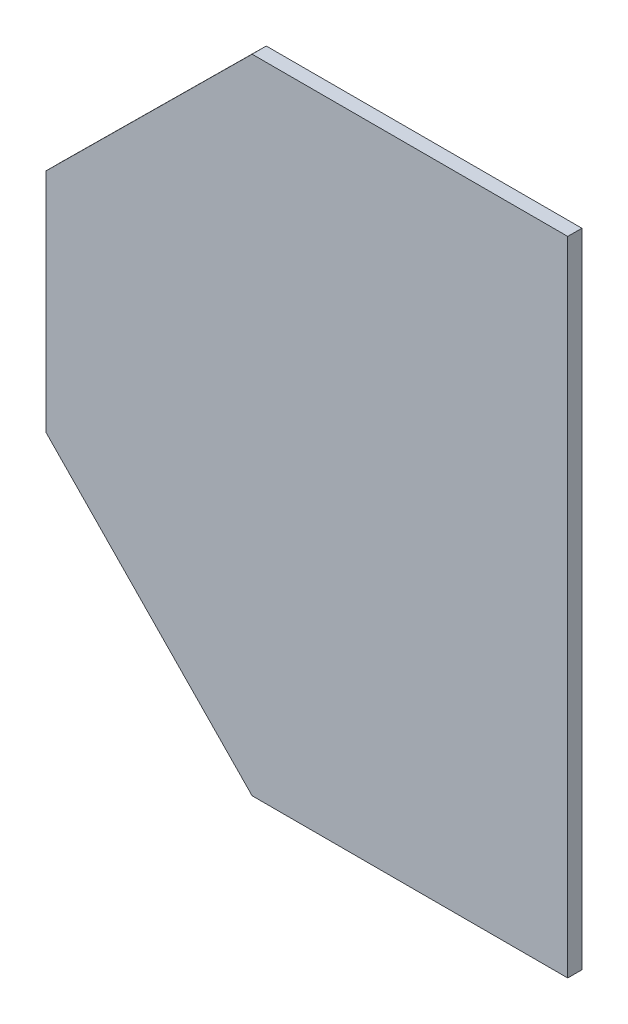
ISO-10303-21;
HEADER;
FILE_DESCRIPTION(('STEP AP214'),'2;1');
FILE_NAME('part.step','',(''),(''),'','','');
FILE_SCHEMA(('AUTOMOTIVE_DESIGN { 1 0 10303 214 1 1 1 1 }'));
ENDSEC;
DATA;
#1=APPLICATION_CONTEXT('core data for automotive mechanical design processes');
#2=APPLICATION_PROTOCOL_DEFINITION('international standard','automotive_design',2000,#1);
#3=PRODUCT_CONTEXT('',#1,'mechanical');
#4=PRODUCT('Part','Part','',(#3));
#5=PRODUCT_RELATED_PRODUCT_CATEGORY('part','',(#4));
#6=PRODUCT_DEFINITION_FORMATION('','',#4);
#7=PRODUCT_DEFINITION_CONTEXT('part definition',#1,'design');
#8=PRODUCT_DEFINITION('design','',#6,#7);
#9=PRODUCT_DEFINITION_SHAPE('','',#8);
#10=(LENGTH_UNIT() NAMED_UNIT(*) SI_UNIT(.MILLI.,.METRE.));
#11=(NAMED_UNIT(*) PLANE_ANGLE_UNIT() SI_UNIT($,.RADIAN.));
#12=(NAMED_UNIT(*) SI_UNIT($,.STERADIAN.) SOLID_ANGLE_UNIT());
#13=UNCERTAINTY_MEASURE_WITH_UNIT(LENGTH_MEASURE(1.E-05),#10,'distance_accuracy_value','');
#14=(GEOMETRIC_REPRESENTATION_CONTEXT(3) GLOBAL_UNCERTAINTY_ASSIGNED_CONTEXT((#13)) GLOBAL_UNIT_ASSIGNED_CONTEXT((#10,
#11,#12)) REPRESENTATION_CONTEXT('',''));
#15=CARTESIAN_POINT('',(0.,0.,0.));
#16=DIRECTION('',(0.,0.,1.));
#17=DIRECTION('',(1.,0.,0.));
#18=AXIS2_PLACEMENT_3D('',#15,#16,#17);
#19=CARTESIAN_POINT('',(-4.28095093104508,285.009681153869,9.525));
#20=DIRECTION('',(-1.,0.,0.));
#21=DIRECTION('',(0.,-1.,0.));
#22=AXIS2_PLACEMENT_3D('',#19,#20,#21);
#23=PLANE('',#22);
#24=DIRECTION('',(0.,1.,0.));
#25=VECTOR('',#24,1.);
#26=CARTESIAN_POINT('',(-4.28095093104508,285.009681153869,0.));
#27=LINE('',#26,#25);
#28=CARTESIAN_POINT('',(-4.28095093104503,-146.790318846131,0.));
#29=VERTEX_POINT('',#28);
#30=CARTESIAN_POINT('',(-4.28095093104508,285.009681153869,0.));
#31=VERTEX_POINT('',#30);
#32=EDGE_CURVE('E117',#29,#31,#27,.T.);
#33=ORIENTED_EDGE('',*,*,#32,.T.);
#34=DIRECTION('',(0.,0.,-1.));
#35=VECTOR('',#34,1.);
#36=CARTESIAN_POINT('',(-4.28095093104508,285.009681153869,9.525));
#37=LINE('',#36,#35);
#38=CARTESIAN_POINT('',(-4.28095093104508,285.009681153869,9.525));
#39=VERTEX_POINT('',#38);
#40=EDGE_CURVE('E11',#39,#31,#37,.T.);
#41=ORIENTED_EDGE('',*,*,#40,.F.);
#42=DIRECTION('',(0.,1.,0.));
#43=VECTOR('',#42,1.);
#44=CARTESIAN_POINT('',(-4.28095093104508,285.009681153869,9.525));
#45=LINE('',#44,#43);
#46=CARTESIAN_POINT('',(-4.28095093104503,-146.790318846131,9.525));
#47=VERTEX_POINT('',#46);
#48=EDGE_CURVE('E127',#47,#39,#45,.T.);
#49=ORIENTED_EDGE('',*,*,#48,.F.);
#50=DIRECTION('',(0.,0.,-1.));
#51=VECTOR('',#50,1.);
#52=CARTESIAN_POINT('',(-4.28095093104503,-146.790318846131,9.525));
#53=LINE('',#52,#51);
#54=EDGE_CURVE('E113',#47,#29,#53,.T.);
#55=ORIENTED_EDGE('',*,*,#54,.T.);
#56=EDGE_LOOP('',(#33,#41,#49,#55));
#57=FACE_BOUND('',#56,.T.);
#58=ADVANCED_FACE('F33',(#57),#23,.F.);
#59=CARTESIAN_POINT('',(-216.488062196188,285.009681153868,9.525));
#60=DIRECTION('',(0.,-1.,0.));
#61=DIRECTION('',(1.,0.,0.));
#62=AXIS2_PLACEMENT_3D('',#59,#60,#61);
#63=PLANE('',#62);
#64=DIRECTION('',(-1.,0.,0.));
#65=VECTOR('',#64,1.);
#66=CARTESIAN_POINT('',(-216.488062196188,285.009681153868,0.));
#67=LINE('',#66,#65);
#68=CARTESIAN_POINT('',(-216.488062196188,285.009681153868,0.));
#69=VERTEX_POINT('',#68);
#70=EDGE_CURVE('E120',#31,#69,#67,.T.);
#71=ORIENTED_EDGE('',*,*,#70,.T.);
#72=DIRECTION('',(0.,0.,-1.));
#73=VECTOR('',#72,1.);
#74=CARTESIAN_POINT('',(-216.488062196188,285.009681153868,9.525));
#75=LINE('',#74,#73);
#76=CARTESIAN_POINT('',(-216.488062196188,285.009681153868,9.525));
#77=VERTEX_POINT('',#76);
#78=EDGE_CURVE('E41',#77,#69,#75,.T.);
#79=ORIENTED_EDGE('',*,*,#78,.F.);
#80=DIRECTION('',(-1.,0.,0.));
#81=VECTOR('',#80,1.);
#82=CARTESIAN_POINT('',(-216.488062196188,285.009681153868,9.525));
#83=LINE('',#82,#81);
#84=EDGE_CURVE('E86',#39,#77,#83,.T.);
#85=ORIENTED_EDGE('',*,*,#84,.F.);
#86=ORIENTED_EDGE('',*,*,#40,.T.);
#87=EDGE_LOOP('',(#71,#79,#85,#86));
#88=FACE_BOUND('',#87,.T.);
#89=ADVANCED_FACE('F151',(#88),#63,.F.);
#90=CARTESIAN_POINT('',(-216.488062196188,285.009681153868,9.525));
#91=DIRECTION('',(0.703672127063357,-0.710524832496466,0.));
#92=DIRECTION('',(0.710524832496466,0.703672127063357,0.));
#93=AXIS2_PLACEMENT_3D('',#90,#91,#92);
#94=PLANE('',#93);
#95=DIRECTION('',(-0.710524832496465,-0.703672127063357,0.));
#96=VECTOR('',#95,1.);
#97=CARTESIAN_POINT('',(-216.488062196188,285.009681153868,0.));
#98=LINE('',#97,#96);
#99=CARTESIAN_POINT('',(-354.995654442996,147.837934871207,0.));
#100=VERTEX_POINT('',#99);
#101=EDGE_CURVE('E122',#69,#100,#98,.T.);
#102=ORIENTED_EDGE('',*,*,#101,.T.);
#103=DIRECTION('',(0.,0.,-1.));
#104=VECTOR('',#103,1.);
#105=CARTESIAN_POINT('',(-354.995654442996,147.837934871207,9.525));
#106=LINE('',#105,#104);
#107=CARTESIAN_POINT('',(-354.995654442996,147.837934871207,9.525));
#108=VERTEX_POINT('',#107);
#109=EDGE_CURVE('E108',#108,#100,#106,.T.);
#110=ORIENTED_EDGE('',*,*,#109,.F.);
#111=DIRECTION('',(-0.710524832496465,-0.703672127063357,0.));
#112=VECTOR('',#111,1.);
#113=CARTESIAN_POINT('',(-216.488062196188,285.009681153868,9.525));
#114=LINE('',#113,#112);
#115=EDGE_CURVE('E99',#77,#108,#114,.T.);
#116=ORIENTED_EDGE('',*,*,#115,.F.);
#117=ORIENTED_EDGE('',*,*,#78,.T.);
#118=EDGE_LOOP('',(#102,#110,#116,#117));
#119=FACE_BOUND('',#118,.T.);
#120=ADVANCED_FACE('F133',(#119),#94,.F.);
#121=CARTESIAN_POINT('',(-354.995654442996,147.837934871207,9.525));
#122=DIRECTION('',(1.,0.,0.));
#123=DIRECTION('',(0.,0.,-1.));
#124=AXIS2_PLACEMENT_3D('',#121,#122,#123);
#125=PLANE('',#124);
#126=DIRECTION('',(0.,-1.,0.));
#127=VECTOR('',#126,1.);
#128=CARTESIAN_POINT('',(-354.995654442996,147.837934871207,0.));
#129=LINE('',#128,#127);
#130=CARTESIAN_POINT('',(-354.995654442996,-4.56206512879289,0.));
#131=VERTEX_POINT('',#130);
#132=EDGE_CURVE('E107',#100,#131,#129,.T.);
#133=ORIENTED_EDGE('',*,*,#132,.T.);
#134=DIRECTION('',(0.,0.,-1.));
#135=VECTOR('',#134,1.);
#136=CARTESIAN_POINT('',(-354.995654442996,-4.56206512879289,9.525));
#137=LINE('',#136,#135);
#138=CARTESIAN_POINT('',(-354.995654442996,-4.56206512879289,9.525));
#139=VERTEX_POINT('',#138);
#140=EDGE_CURVE('E104',#139,#131,#137,.T.);
#141=ORIENTED_EDGE('',*,*,#140,.F.);
#142=DIRECTION('',(0.,-1.,0.));
#143=VECTOR('',#142,1.);
#144=CARTESIAN_POINT('',(-354.995654442996,147.837934871207,9.525));
#145=LINE('',#144,#143);
#146=EDGE_CURVE('E93',#108,#139,#145,.T.);
#147=ORIENTED_EDGE('',*,*,#146,.F.);
#148=ORIENTED_EDGE('',*,*,#109,.T.);
#149=EDGE_LOOP('',(#133,#141,#147,#148));
#150=FACE_BOUND('',#149,.T.);
#151=ADVANCED_FACE('F105',(#150),#125,.F.);
#152=CARTESIAN_POINT('',(-354.995654442996,-4.56206512879289,9.525));
#153=DIRECTION('',(0.71641532602297,0.697674050427133,0.));
#154=DIRECTION('',(-0.697674050427133,0.71641532602297,0.));
#155=AXIS2_PLACEMENT_3D('',#152,#153,#154);
#156=PLANE('',#155);
#157=DIRECTION('',(0.697674050427133,-0.71641532602297,0.));
#158=VECTOR('',#157,1.);
#159=CARTESIAN_POINT('',(-354.995654442996,-4.56206512879289,0.));
#160=LINE('',#159,#158);
#161=CARTESIAN_POINT('',(-216.488062196188,-146.790318846131,0.));
#162=VERTEX_POINT('',#161);
#163=EDGE_CURVE('E72',#131,#162,#160,.T.);
#164=ORIENTED_EDGE('',*,*,#163,.T.);
#165=DIRECTION('',(0.,0.,-1.));
#166=VECTOR('',#165,1.);
#167=CARTESIAN_POINT('',(-216.488062196188,-146.790318846131,9.525));
#168=LINE('',#167,#166);
#169=CARTESIAN_POINT('',(-216.488062196188,-146.790318846131,9.525));
#170=VERTEX_POINT('',#169);
#171=EDGE_CURVE('E109',#170,#162,#168,.T.);
#172=ORIENTED_EDGE('',*,*,#171,.F.);
#173=DIRECTION('',(0.697674050427133,-0.71641532602297,0.));
#174=VECTOR('',#173,1.);
#175=CARTESIAN_POINT('',(-354.995654442996,-4.56206512879289,9.525));
#176=LINE('',#175,#174);
#177=EDGE_CURVE('E97',#139,#170,#176,.T.);
#178=ORIENTED_EDGE('',*,*,#177,.F.);
#179=ORIENTED_EDGE('',*,*,#140,.T.);
#180=EDGE_LOOP('',(#164,#172,#178,#179));
#181=FACE_BOUND('',#180,.T.);
#182=ADVANCED_FACE('F111',(#181),#156,.F.);
#183=CARTESIAN_POINT('',(-4.28095093104503,-146.790318846131,9.525));
#184=DIRECTION('',(0.,1.,0.));
#185=DIRECTION('',(-1.,0.,0.));
#186=AXIS2_PLACEMENT_3D('',#183,#184,#185);
#187=PLANE('',#186);
#188=DIRECTION('',(1.,0.,0.));
#189=VECTOR('',#188,1.);
#190=CARTESIAN_POINT('',(-4.28095093104503,-146.790318846131,0.));
#191=LINE('',#190,#189);
#192=EDGE_CURVE('E78',#162,#29,#191,.T.);
#193=ORIENTED_EDGE('',*,*,#192,.T.);
#194=ORIENTED_EDGE('',*,*,#54,.F.);
#195=DIRECTION('',(1.,0.,0.));
#196=VECTOR('',#195,1.);
#197=CARTESIAN_POINT('',(-4.28095093104503,-146.790318846131,9.525));
#198=LINE('',#197,#196);
#199=EDGE_CURVE('E49',#170,#47,#198,.T.);
#200=ORIENTED_EDGE('',*,*,#199,.F.);
#201=ORIENTED_EDGE('',*,*,#171,.T.);
#202=EDGE_LOOP('',(#193,#194,#200,#201));
#203=FACE_BOUND('',#202,.T.);
#204=ADVANCED_FACE('F140',(#203),#187,.F.);
#205=CARTESIAN_POINT('',(0.,0.,9.525));
#206=DIRECTION('',(0.,0.,-1.));
#207=DIRECTION('',(-1.,0.,0.));
#208=AXIS2_PLACEMENT_3D('',#205,#206,#207);
#209=PLANE('',#208);
#210=ORIENTED_EDGE('',*,*,#48,.T.);
#211=ORIENTED_EDGE('',*,*,#84,.T.);
#212=ORIENTED_EDGE('',*,*,#115,.T.);
#213=ORIENTED_EDGE('',*,*,#146,.T.);
#214=ORIENTED_EDGE('',*,*,#177,.T.);
#215=ORIENTED_EDGE('',*,*,#199,.T.);
#216=EDGE_LOOP('',(#210,#211,#212,#213,#214,#215));
#217=FACE_BOUND('',#216,.T.);
#218=ADVANCED_FACE('F95',(#217),#209,.F.);
#219=CARTESIAN_POINT('',(0.,0.,0.));
#220=DIRECTION('',(0.,0.,-1.));
#221=DIRECTION('',(-1.,0.,0.));
#222=AXIS2_PLACEMENT_3D('',#219,#220,#221);
#223=PLANE('',#222);
#224=ORIENTED_EDGE('',*,*,#32,.F.);
#225=ORIENTED_EDGE('',*,*,#192,.F.);
#226=ORIENTED_EDGE('',*,*,#163,.F.);
#227=ORIENTED_EDGE('',*,*,#132,.F.);
#228=ORIENTED_EDGE('',*,*,#101,.F.);
#229=ORIENTED_EDGE('',*,*,#70,.F.);
#230=EDGE_LOOP('',(#224,#225,#226,#227,#228,#229));
#231=FACE_BOUND('',#230,.T.);
#232=ADVANCED_FACE('F136',(#231),#223,.T.);
#233=CLOSED_SHELL('',(#58,#89,#120,#151,#182,#204,#218,#232));
#234=MANIFOLD_SOLID_BREP('B2',#233);
#235=ADVANCED_BREP_SHAPE_REPRESENTATION('',(#18,#234),#14);
#236=SHAPE_DEFINITION_REPRESENTATION(#9,#235);
ENDSEC;
END-ISO-10303-21;
